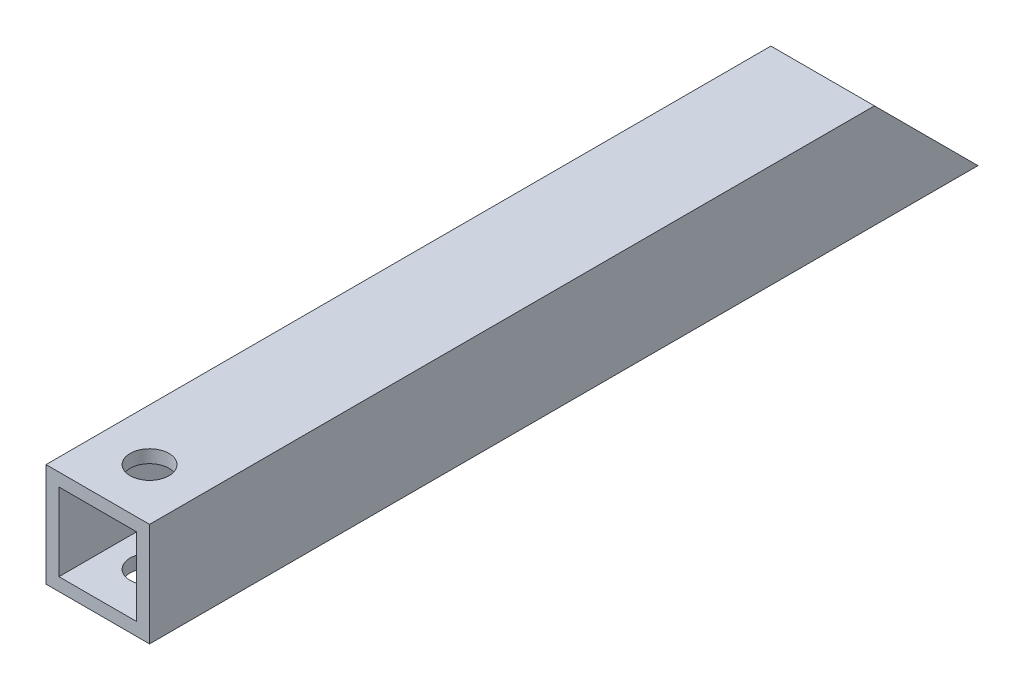
ISO-10303-21;
HEADER;
FILE_DESCRIPTION(('STEP AP214'),'2;1');
FILE_NAME('part.step','',(''),(''),'','','');
FILE_SCHEMA(('AUTOMOTIVE_DESIGN { 1 0 10303 214 1 1 1 1 }'));
ENDSEC;
DATA;
#1=APPLICATION_CONTEXT('core data for automotive mechanical design processes');
#2=APPLICATION_PROTOCOL_DEFINITION('international standard','automotive_design',2000,#1);
#3=PRODUCT_CONTEXT('',#1,'mechanical');
#4=PRODUCT('Part','Part','',(#3));
#5=PRODUCT_RELATED_PRODUCT_CATEGORY('part','',(#4));
#6=PRODUCT_DEFINITION_FORMATION('','',#4);
#7=PRODUCT_DEFINITION_CONTEXT('part definition',#1,'design');
#8=PRODUCT_DEFINITION('design','',#6,#7);
#9=PRODUCT_DEFINITION_SHAPE('','',#8);
#10=(LENGTH_UNIT() NAMED_UNIT(*) SI_UNIT(.MILLI.,.METRE.));
#11=(NAMED_UNIT(*) PLANE_ANGLE_UNIT() SI_UNIT($,.RADIAN.));
#12=(NAMED_UNIT(*) SI_UNIT($,.STERADIAN.) SOLID_ANGLE_UNIT());
#13=UNCERTAINTY_MEASURE_WITH_UNIT(LENGTH_MEASURE(1.E-05),#10,'distance_accuracy_value','');
#14=(GEOMETRIC_REPRESENTATION_CONTEXT(3) GLOBAL_UNCERTAINTY_ASSIGNED_CONTEXT((#13)) GLOBAL_UNIT_ASSIGNED_CONTEXT((#10,
#11,#12)) REPRESENTATION_CONTEXT('',''));
#15=CARTESIAN_POINT('',(0.,0.,0.));
#16=DIRECTION('',(0.,0.,1.));
#17=DIRECTION('',(1.,0.,0.));
#18=AXIS2_PLACEMENT_3D('',#15,#16,#17);
#19=CARTESIAN_POINT('',(0.,0.,203.2));
#20=DIRECTION('',(0.,0.,1.));
#21=DIRECTION('',(1.,0.,0.));
#22=AXIS2_PLACEMENT_3D('',#19,#20,#21);
#23=PLANE('',#22);
#24=DIRECTION('',(0.,-1.,0.));
#25=VECTOR('',#24,1.);
#26=CARTESIAN_POINT('',(-12.7,-12.7,203.2));
#27=LINE('',#26,#25);
#28=CARTESIAN_POINT('',(-12.7,12.7,203.2));
#29=VERTEX_POINT('',#28);
#30=CARTESIAN_POINT('',(-12.7,-12.7,203.2));
#31=VERTEX_POINT('',#30);
#32=EDGE_CURVE('E109',#29,#31,#27,.T.);
#33=ORIENTED_EDGE('',*,*,#32,.T.);
#34=DIRECTION('',(1.,0.,0.));
#35=VECTOR('',#34,1.);
#36=CARTESIAN_POINT('',(12.7,-12.7,203.2));
#37=LINE('',#36,#35);
#38=CARTESIAN_POINT('',(12.7,-12.7,203.2));
#39=VERTEX_POINT('',#38);
#40=EDGE_CURVE('E121',#31,#39,#37,.T.);
#41=ORIENTED_EDGE('',*,*,#40,.T.);
#42=DIRECTION('',(0.,1.,0.));
#43=VECTOR('',#42,1.);
#44=CARTESIAN_POINT('',(12.7,-12.7,203.2));
#45=LINE('',#44,#43);
#46=CARTESIAN_POINT('',(12.7,12.7,203.2));
#47=VERTEX_POINT('',#46);
#48=EDGE_CURVE('E133',#39,#47,#45,.T.);
#49=ORIENTED_EDGE('',*,*,#48,.T.);
#50=DIRECTION('',(-1.,0.,0.));
#51=VECTOR('',#50,1.);
#52=CARTESIAN_POINT('',(12.7,12.7,203.2));
#53=LINE('',#52,#51);
#54=EDGE_CURVE('E130',#47,#29,#53,.T.);
#55=ORIENTED_EDGE('',*,*,#54,.T.);
#56=EDGE_LOOP('',(#33,#41,#49,#55));
#57=FACE_BOUND('',#56,.T.);
#58=DIRECTION('',(-1.,0.,0.));
#59=VECTOR('',#58,1.);
#60=CARTESIAN_POINT('',(9.525,9.525,203.2));
#61=LINE('',#60,#59);
#62=CARTESIAN_POINT('',(9.525,9.525,203.2));
#63=VERTEX_POINT('',#62);
#64=CARTESIAN_POINT('',(-9.525,9.525,203.2));
#65=VERTEX_POINT('',#64);
#66=EDGE_CURVE('E153',#63,#65,#61,.T.);
#67=ORIENTED_EDGE('',*,*,#66,.F.);
#68=DIRECTION('',(0.,1.,0.));
#69=VECTOR('',#68,1.);
#70=CARTESIAN_POINT('',(9.525,-9.525,203.2));
#71=LINE('',#70,#69);
#72=CARTESIAN_POINT('',(9.525,-9.525,203.2));
#73=VERTEX_POINT('',#72);
#74=EDGE_CURVE('E155',#73,#63,#71,.T.);
#75=ORIENTED_EDGE('',*,*,#74,.F.);
#76=DIRECTION('',(1.,0.,0.));
#77=VECTOR('',#76,1.);
#78=CARTESIAN_POINT('',(9.525,-9.525,203.2));
#79=LINE('',#78,#77);
#80=CARTESIAN_POINT('',(-9.525,-9.525,203.2));
#81=VERTEX_POINT('',#80);
#82=EDGE_CURVE('E148',#81,#73,#79,.T.);
#83=ORIENTED_EDGE('',*,*,#82,.F.);
#84=DIRECTION('',(0.,-1.,0.));
#85=VECTOR('',#84,1.);
#86=CARTESIAN_POINT('',(-9.525,-9.525,203.2));
#87=LINE('',#86,#85);
#88=EDGE_CURVE('E150',#65,#81,#87,.T.);
#89=ORIENTED_EDGE('',*,*,#88,.F.);
#90=EDGE_LOOP('',(#67,#75,#83,#89));
#91=FACE_BOUND('',#90,.T.);
#92=ADVANCED_FACE('F38',(#57,#91),#23,.T.);
#93=CARTESIAN_POINT('',(-12.7,-12.7,203.2));
#94=DIRECTION('',(1.,0.,0.));
#95=DIRECTION('',(0.,0.,-1.));
#96=AXIS2_PLACEMENT_3D('',#93,#94,#95);
#97=PLANE('',#96);
#98=DIRECTION('',(0.,0.,-1.));
#99=VECTOR('',#98,1.);
#100=CARTESIAN_POINT('',(-12.7,12.7,203.2));
#101=LINE('',#100,#99);
#102=CARTESIAN_POINT('',(-12.7,12.7,25.4000000000003));
#103=VERTEX_POINT('',#102);
#104=EDGE_CURVE('E117',#29,#103,#101,.T.);
#105=ORIENTED_EDGE('',*,*,#104,.T.);
#106=DIRECTION('',(0.,-0.707106781186544,-0.707106781186551));
#107=VECTOR('',#106,1.);
#108=CARTESIAN_POINT('',(-12.7,-12.7,0.));
#109=LINE('',#108,#107);
#110=CARTESIAN_POINT('',(-12.7,-12.7,0.));
#111=VERTEX_POINT('',#110);
#112=EDGE_CURVE('E54',#103,#111,#109,.T.);
#113=ORIENTED_EDGE('',*,*,#112,.T.);
#114=DIRECTION('',(0.,0.,-1.));
#115=VECTOR('',#114,1.);
#116=CARTESIAN_POINT('',(-12.7,-12.7,203.2));
#117=LINE('',#116,#115);
#118=EDGE_CURVE('E47',#31,#111,#117,.T.);
#119=ORIENTED_EDGE('',*,*,#118,.F.);
#120=ORIENTED_EDGE('',*,*,#32,.F.);
#121=EDGE_LOOP('',(#105,#113,#119,#120));
#122=FACE_BOUND('',#121,.T.);
#123=ADVANCED_FACE('F40',(#122),#97,.F.);
#124=CARTESIAN_POINT('',(12.7,-12.7,203.2));
#125=DIRECTION('',(0.,1.,0.));
#126=DIRECTION('',(-1.,0.,0.));
#127=AXIS2_PLACEMENT_3D('',#124,#125,#126);
#128=PLANE('',#127);
#129=CARTESIAN_POINT('',(0.,-12.7,190.5));
#130=DIRECTION('',(0.,-1.,0.));
#131=DIRECTION('',(0.,0.,-1.));
#132=AXIS2_PLACEMENT_3D('',#129,#130,#131);
#133=CIRCLE('',#132,4.7625);
#134=CARTESIAN_POINT('',(0.,-12.7,185.7375));
#135=VERTEX_POINT('',#134);
#136=EDGE_CURVE('E170',#135,#135,#133,.T.);
#137=ORIENTED_EDGE('',*,*,#136,.F.);
#138=EDGE_LOOP('',(#137));
#139=FACE_BOUND('',#138,.T.);
#140=DIRECTION('',(1.,0.,0.));
#141=VECTOR('',#140,1.);
#142=CARTESIAN_POINT('',(12.7,-12.7,0.));
#143=LINE('',#142,#141);
#144=CARTESIAN_POINT('',(12.7,-12.7,0.));
#145=VERTEX_POINT('',#144);
#146=EDGE_CURVE('E101',#111,#145,#143,.T.);
#147=ORIENTED_EDGE('',*,*,#146,.T.);
#148=DIRECTION('',(0.,0.,-1.));
#149=VECTOR('',#148,1.);
#150=CARTESIAN_POINT('',(12.7,-12.7,203.2));
#151=LINE('',#150,#149);
#152=EDGE_CURVE('E123',#39,#145,#151,.T.);
#153=ORIENTED_EDGE('',*,*,#152,.F.);
#154=ORIENTED_EDGE('',*,*,#40,.F.);
#155=ORIENTED_EDGE('',*,*,#118,.T.);
#156=EDGE_LOOP('',(#147,#153,#154,#155));
#157=FACE_BOUND('',#156,.T.);
#158=ADVANCED_FACE('F120',(#139,#157),#128,.F.);
#159=CARTESIAN_POINT('',(12.7,-12.7,203.2));
#160=DIRECTION('',(-1.,0.,0.));
#161=DIRECTION('',(0.,0.,1.));
#162=AXIS2_PLACEMENT_3D('',#159,#160,#161);
#163=PLANE('',#162);
#164=ORIENTED_EDGE('',*,*,#152,.T.);
#165=DIRECTION('',(0.,-0.707106781186544,-0.707106781186551));
#166=VECTOR('',#165,1.);
#167=CARTESIAN_POINT('',(12.7,-12.7,0.));
#168=LINE('',#167,#166);
#169=CARTESIAN_POINT('',(12.7,12.7,25.4000000000003));
#170=VERTEX_POINT('',#169);
#171=EDGE_CURVE('E104',#170,#145,#168,.T.);
#172=ORIENTED_EDGE('',*,*,#171,.F.);
#173=DIRECTION('',(0.,0.,-1.));
#174=VECTOR('',#173,1.);
#175=CARTESIAN_POINT('',(12.7,12.7,203.2));
#176=LINE('',#175,#174);
#177=EDGE_CURVE('E125',#47,#170,#176,.T.);
#178=ORIENTED_EDGE('',*,*,#177,.F.);
#179=ORIENTED_EDGE('',*,*,#48,.F.);
#180=EDGE_LOOP('',(#164,#172,#178,#179));
#181=FACE_BOUND('',#180,.T.);
#182=ADVANCED_FACE('F177',(#181),#163,.F.);
#183=CARTESIAN_POINT('',(12.7,12.7,203.2));
#184=DIRECTION('',(0.,-1.,0.));
#185=DIRECTION('',(1.,0.,0.));
#186=AXIS2_PLACEMENT_3D('',#183,#184,#185);
#187=PLANE('',#186);
#188=CARTESIAN_POINT('',(0.,12.7,190.5));
#189=DIRECTION('',(0.,-1.,0.));
#190=DIRECTION('',(0.,0.,-1.));
#191=AXIS2_PLACEMENT_3D('',#188,#189,#190);
#192=CIRCLE('',#191,4.76249999999999);
#193=CARTESIAN_POINT('',(0.,12.7,185.7375));
#194=VERTEX_POINT('',#193);
#195=EDGE_CURVE('E167',#194,#194,#192,.T.);
#196=ORIENTED_EDGE('',*,*,#195,.T.);
#197=EDGE_LOOP('',(#196));
#198=FACE_BOUND('',#197,.T.);
#199=ORIENTED_EDGE('',*,*,#177,.T.);
#200=DIRECTION('',(1.,0.,0.));
#201=VECTOR('',#200,1.);
#202=CARTESIAN_POINT('',(-12.7,12.7,25.4000000000003));
#203=LINE('',#202,#201);
#204=EDGE_CURVE('E118',#103,#170,#203,.T.);
#205=ORIENTED_EDGE('',*,*,#204,.F.);
#206=ORIENTED_EDGE('',*,*,#104,.F.);
#207=ORIENTED_EDGE('',*,*,#54,.F.);
#208=EDGE_LOOP('',(#199,#205,#206,#207));
#209=FACE_BOUND('',#208,.T.);
#210=ADVANCED_FACE('F182',(#198,#209),#187,.F.);
#211=CARTESIAN_POINT('',(9.525,-9.525,203.2));
#212=DIRECTION('',(-1.,0.,0.));
#213=DIRECTION('',(0.,0.,1.));
#214=AXIS2_PLACEMENT_3D('',#211,#212,#213);
#215=PLANE('',#214);
#216=DIRECTION('',(0.,0.707106781186544,0.707106781186551));
#217=VECTOR('',#216,1.);
#218=CARTESIAN_POINT('',(9.525,90.4875,103.187500000001));
#219=LINE('',#218,#217);
#220=CARTESIAN_POINT('',(9.525,-9.525,3.17500000000004));
#221=VERTEX_POINT('',#220);
#222=CARTESIAN_POINT('',(9.525,9.525,22.2250000000002));
#223=VERTEX_POINT('',#222);
#224=EDGE_CURVE('E157',#221,#223,#219,.T.);
#225=ORIENTED_EDGE('',*,*,#224,.F.);
#226=DIRECTION('',(0.,0.,-1.));
#227=VECTOR('',#226,1.);
#228=CARTESIAN_POINT('',(9.525,-9.525,203.2));
#229=LINE('',#228,#227);
#230=EDGE_CURVE('E145',#73,#221,#229,.T.);
#231=ORIENTED_EDGE('',*,*,#230,.F.);
#232=ORIENTED_EDGE('',*,*,#74,.T.);
#233=DIRECTION('',(0.,0.,-1.));
#234=VECTOR('',#233,1.);
#235=CARTESIAN_POINT('',(9.525,9.525,203.2));
#236=LINE('',#235,#234);
#237=EDGE_CURVE('E110',#63,#223,#236,.T.);
#238=ORIENTED_EDGE('',*,*,#237,.T.);
#239=EDGE_LOOP('',(#225,#231,#232,#238));
#240=FACE_BOUND('',#239,.T.);
#241=ADVANCED_FACE('F193',(#240),#215,.T.);
#242=CARTESIAN_POINT('',(9.525,9.525,203.2));
#243=DIRECTION('',(0.,-1.,0.));
#244=DIRECTION('',(1.,0.,0.));
#245=AXIS2_PLACEMENT_3D('',#242,#243,#244);
#246=PLANE('',#245);
#247=CARTESIAN_POINT('',(0.,9.525,190.5));
#248=DIRECTION('',(0.,-1.,0.));
#249=DIRECTION('',(1.,0.,0.));
#250=AXIS2_PLACEMENT_3D('',#247,#248,#249);
#251=CIRCLE('',#250,4.76249999999999);
#252=CARTESIAN_POINT('',(4.7625,9.525,190.5));
#253=VERTEX_POINT('',#252);
#254=EDGE_CURVE('E163',#253,#253,#251,.T.);
#255=ORIENTED_EDGE('',*,*,#254,.F.);
#256=EDGE_LOOP('',(#255));
#257=FACE_BOUND('',#256,.T.);
#258=DIRECTION('',(-1.,0.,0.));
#259=VECTOR('',#258,1.);
#260=CARTESIAN_POINT('',(9.52500000000003,9.525,22.2250000000002));
#261=LINE('',#260,#259);
#262=CARTESIAN_POINT('',(-9.525,9.52499999999999,22.2250000000002));
#263=VERTEX_POINT('',#262);
#264=EDGE_CURVE('E159',#223,#263,#261,.T.);
#265=ORIENTED_EDGE('',*,*,#264,.F.);
#266=ORIENTED_EDGE('',*,*,#237,.F.);
#267=ORIENTED_EDGE('',*,*,#66,.T.);
#268=DIRECTION('',(0.,0.,-1.));
#269=VECTOR('',#268,1.);
#270=CARTESIAN_POINT('',(-9.525,9.525,203.2));
#271=LINE('',#270,#269);
#272=EDGE_CURVE('E139',#65,#263,#271,.T.);
#273=ORIENTED_EDGE('',*,*,#272,.T.);
#274=EDGE_LOOP('',(#265,#266,#267,#273));
#275=FACE_BOUND('',#274,.T.);
#276=ADVANCED_FACE('F200',(#257,#275),#246,.T.);
#277=CARTESIAN_POINT('',(-9.525,-9.525,203.2));
#278=DIRECTION('',(1.,0.,0.));
#279=DIRECTION('',(0.,0.,-1.));
#280=AXIS2_PLACEMENT_3D('',#277,#278,#279);
#281=PLANE('',#280);
#282=DIRECTION('',(0.,-0.707106781186544,-0.707106781186551));
#283=VECTOR('',#282,1.);
#284=CARTESIAN_POINT('',(-9.525,90.4875,103.187500000001));
#285=LINE('',#284,#283);
#286=CARTESIAN_POINT('',(-9.525,-9.525,3.17500000000004));
#287=VERTEX_POINT('',#286);
#288=EDGE_CURVE('E61',#263,#287,#285,.T.);
#289=ORIENTED_EDGE('',*,*,#288,.F.);
#290=ORIENTED_EDGE('',*,*,#272,.F.);
#291=ORIENTED_EDGE('',*,*,#88,.T.);
#292=DIRECTION('',(0.,0.,-1.));
#293=VECTOR('',#292,1.);
#294=CARTESIAN_POINT('',(-9.525,-9.525,203.2));
#295=LINE('',#294,#293);
#296=EDGE_CURVE('E142',#81,#287,#295,.T.);
#297=ORIENTED_EDGE('',*,*,#296,.T.);
#298=EDGE_LOOP('',(#289,#290,#291,#297));
#299=FACE_BOUND('',#298,.T.);
#300=ADVANCED_FACE('F222',(#299),#281,.T.);
#301=CARTESIAN_POINT('',(9.525,-9.525,203.2));
#302=DIRECTION('',(0.,1.,0.));
#303=DIRECTION('',(-1.,0.,0.));
#304=AXIS2_PLACEMENT_3D('',#301,#302,#303);
#305=PLANE('',#304);
#306=CARTESIAN_POINT('',(0.,-9.525,190.5));
#307=DIRECTION('',(0.,1.,0.));
#308=DIRECTION('',(-1.,0.,0.));
#309=AXIS2_PLACEMENT_3D('',#306,#307,#308);
#310=CIRCLE('',#309,4.76249999999999);
#311=CARTESIAN_POINT('',(-4.76249999999999,-9.525,190.5));
#312=VERTEX_POINT('',#311);
#313=EDGE_CURVE('E42',#312,#312,#310,.T.);
#314=ORIENTED_EDGE('',*,*,#313,.F.);
#315=EDGE_LOOP('',(#314));
#316=FACE_BOUND('',#315,.T.);
#317=DIRECTION('',(1.,0.,0.));
#318=VECTOR('',#317,1.);
#319=CARTESIAN_POINT('',(9.52500000000003,-9.525,3.17500000000004));
#320=LINE('',#319,#318);
#321=EDGE_CURVE('E11',#287,#221,#320,.T.);
#322=ORIENTED_EDGE('',*,*,#321,.F.);
#323=ORIENTED_EDGE('',*,*,#296,.F.);
#324=ORIENTED_EDGE('',*,*,#82,.T.);
#325=ORIENTED_EDGE('',*,*,#230,.T.);
#326=EDGE_LOOP('',(#322,#323,#324,#325));
#327=FACE_BOUND('',#326,.T.);
#328=ADVANCED_FACE('F219',(#316,#327),#305,.T.);
#329=CARTESIAN_POINT('',(-12.7,-12.7,0.));
#330=DIRECTION('',(0.,-0.707106781186551,0.707106781186543));
#331=DIRECTION('',(0.,-0.707106781186544,-0.707106781186551));
#332=AXIS2_PLACEMENT_3D('',#329,#330,#331);
#333=PLANE('',#332);
#334=ORIENTED_EDGE('',*,*,#224,.T.);
#335=ORIENTED_EDGE('',*,*,#264,.T.);
#336=ORIENTED_EDGE('',*,*,#288,.T.);
#337=ORIENTED_EDGE('',*,*,#321,.T.);
#338=EDGE_LOOP('',(#334,#335,#336,#337));
#339=FACE_BOUND('',#338,.T.);
#340=ORIENTED_EDGE('',*,*,#171,.T.);
#341=ORIENTED_EDGE('',*,*,#146,.F.);
#342=ORIENTED_EDGE('',*,*,#112,.F.);
#343=ORIENTED_EDGE('',*,*,#204,.T.);
#344=EDGE_LOOP('',(#340,#341,#342,#343));
#345=FACE_BOUND('',#344,.T.);
#346=ADVANCED_FACE('F102',(#339,#345),#333,.F.);
#347=CARTESIAN_POINT('',(0.,-12.7,190.5));
#348=DIRECTION('',(0.,-1.,0.));
#349=DIRECTION('',(0.,0.,-1.));
#350=AXIS2_PLACEMENT_3D('',#347,#348,#349);
#351=CYLINDRICAL_SURFACE('',#350,4.76249999999999);
#352=ORIENTED_EDGE('',*,*,#313,.T.);
#353=EDGE_LOOP('',(#352));
#354=FACE_BOUND('',#353,.T.);
#355=ORIENTED_EDGE('',*,*,#136,.T.);
#356=EDGE_LOOP('',(#355));
#357=FACE_BOUND('',#356,.T.);
#358=ADVANCED_FACE('F174',(#354,#357),#351,.F.);
#359=ORIENTED_EDGE('',*,*,#254,.T.);
#360=EDGE_LOOP('',(#359));
#361=FACE_BOUND('',#360,.T.);
#362=ORIENTED_EDGE('',*,*,#195,.F.);
#363=EDGE_LOOP('',(#362));
#364=FACE_BOUND('',#363,.T.);
#365=ADVANCED_FACE('F208',(#361,#364),#351,.F.);
#366=CLOSED_SHELL('',(#92,#123,#158,#182,#210,#241,#276,#300,#328,#346,#358,#365));
#367=MANIFOLD_SOLID_BREP('B2',#366);
#368=ADVANCED_BREP_SHAPE_REPRESENTATION('',(#18,#367),#14);
#369=SHAPE_DEFINITION_REPRESENTATION(#9,#368);
ENDSEC;
END-ISO-10303-21;
